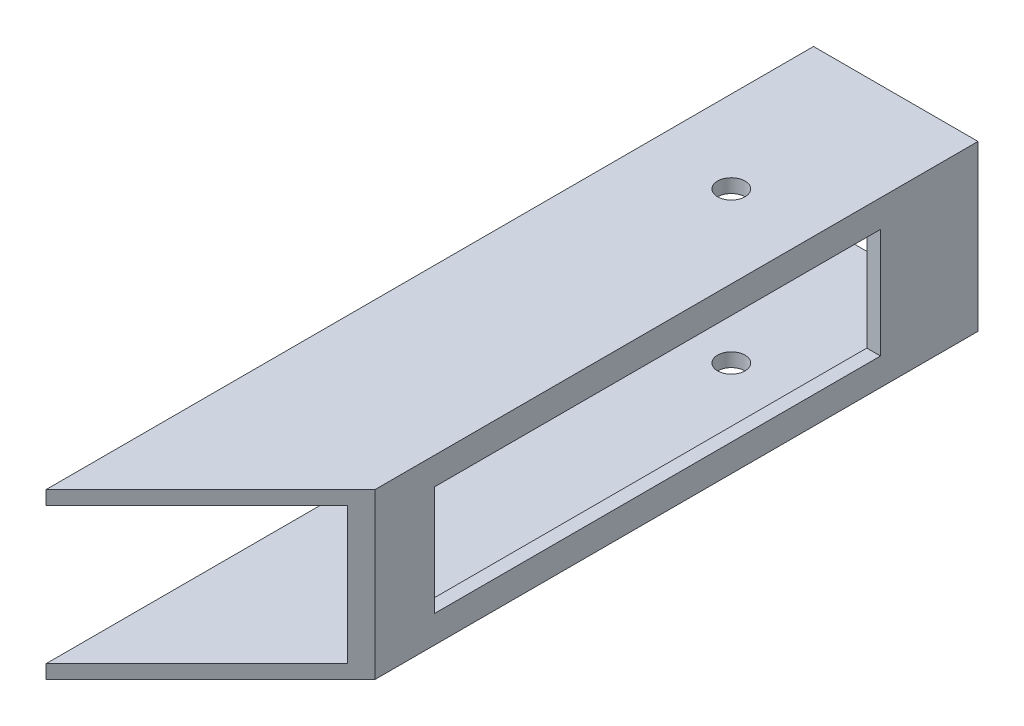
ISO-10303-21;
HEADER;
FILE_DESCRIPTION(('STEP AP214'),'2;1');
FILE_NAME('part.step','',(''),(''),'','','');
FILE_SCHEMA(('AUTOMOTIVE_DESIGN { 1 0 10303 214 1 1 1 1 }'));
ENDSEC;
DATA;
#1=APPLICATION_CONTEXT('core data for automotive mechanical design processes');
#2=APPLICATION_PROTOCOL_DEFINITION('international standard','automotive_design',2000,#1);
#3=PRODUCT_CONTEXT('',#1,'mechanical');
#4=PRODUCT('Part','Part','',(#3));
#5=PRODUCT_RELATED_PRODUCT_CATEGORY('part','',(#4));
#6=PRODUCT_DEFINITION_FORMATION('','',#4);
#7=PRODUCT_DEFINITION_CONTEXT('part definition',#1,'design');
#8=PRODUCT_DEFINITION('design','',#6,#7);
#9=PRODUCT_DEFINITION_SHAPE('','',#8);
#10=(LENGTH_UNIT() NAMED_UNIT(*) SI_UNIT(.MILLI.,.METRE.));
#11=(NAMED_UNIT(*) PLANE_ANGLE_UNIT() SI_UNIT($,.RADIAN.));
#12=(NAMED_UNIT(*) SI_UNIT($,.STERADIAN.) SOLID_ANGLE_UNIT());
#13=UNCERTAINTY_MEASURE_WITH_UNIT(LENGTH_MEASURE(1.E-05),#10,'distance_accuracy_value','');
#14=(GEOMETRIC_REPRESENTATION_CONTEXT(3) GLOBAL_UNCERTAINTY_ASSIGNED_CONTEXT((#13)) GLOBAL_UNIT_ASSIGNED_CONTEXT((#10,
#11,#12)) REPRESENTATION_CONTEXT('',''));
#15=CARTESIAN_POINT('',(0.,0.,0.));
#16=DIRECTION('',(0.,0.,1.));
#17=DIRECTION('',(1.,0.,0.));
#18=AXIS2_PLACEMENT_3D('',#15,#16,#17);
#19=CARTESIAN_POINT('',(-19.05,0.,-12.7));
#20=DIRECTION('',(-1.,0.,0.));
#21=DIRECTION('',(0.,0.,1.));
#22=AXIS2_PLACEMENT_3D('',#19,#20,#21);
#23=PLANE('',#22);
#24=DIRECTION('',(0.,0.,-1.));
#25=VECTOR('',#24,1.);
#26=CARTESIAN_POINT('',(-19.05,34.925,-38.1));
#27=LINE('',#26,#25);
#28=CARTESIAN_POINT('',(-19.05,34.925,139.7));
#29=VERTEX_POINT('',#28);
#30=CARTESIAN_POINT('',(-19.05,34.925,-38.1));
#31=VERTEX_POINT('',#30);
#32=EDGE_CURVE('E152',#29,#31,#27,.T.);
#33=ORIENTED_EDGE('',*,*,#32,.F.);
#34=DIRECTION('',(0.,1.,0.));
#35=VECTOR('',#34,1.);
#36=CARTESIAN_POINT('',(-19.05,-0.000500000000001055,139.7));
#37=LINE('',#36,#35);
#38=CARTESIAN_POINT('',(-19.05,38.1,139.7));
#39=VERTEX_POINT('',#38);
#40=EDGE_CURVE('E175',#29,#39,#37,.T.);
#41=ORIENTED_EDGE('',*,*,#40,.T.);
#42=DIRECTION('',(0.,0.,1.));
#43=VECTOR('',#42,1.);
#44=CARTESIAN_POINT('',(-19.05,38.1,12.7));
#45=LINE('',#44,#43);
#46=CARTESIAN_POINT('',(-19.05,38.1,-38.1));
#47=VERTEX_POINT('',#46);
#48=EDGE_CURVE('E178',#47,#39,#45,.T.);
#49=ORIENTED_EDGE('',*,*,#48,.F.);
#50=DIRECTION('',(0.,1.,0.));
#51=VECTOR('',#50,1.);
#52=CARTESIAN_POINT('',(-19.05,0.,-38.1));
#53=LINE('',#52,#51);
#54=EDGE_CURVE('E168',#31,#47,#53,.T.);
#55=ORIENTED_EDGE('',*,*,#54,.F.);
#56=EDGE_LOOP('',(#33,#41,#49,#55));
#57=FACE_BOUND('',#56,.T.);
#58=ADVANCED_FACE('F33',(#57),#23,.T.);
#59=CARTESIAN_POINT('',(-19.05,-0.00100000000000211,139.7));
#60=DIRECTION('',(0.707106781187333,0.,0.707106781185763));
#61=DIRECTION('',(0.707106781185763,0.,-0.707106781187333));
#62=AXIS2_PLACEMENT_3D('',#59,#60,#61);
#63=PLANE('',#62);
#64=ORIENTED_EDGE('',*,*,#40,.F.);
#65=DIRECTION('',(-0.707106781185763,0.,0.707106781187333));
#66=VECTOR('',#65,1.);
#67=CARTESIAN_POINT('',(20.6374999999894,34.925,100.012499999922));
#68=LINE('',#67,#66);
#69=CARTESIAN_POINT('',(15.875,34.925,104.774999999922));
#70=VERTEX_POINT('',#69);
#71=EDGE_CURVE('E176',#70,#29,#68,.T.);
#72=ORIENTED_EDGE('',*,*,#71,.F.);
#73=DIRECTION('',(0.,1.,0.));
#74=VECTOR('',#73,1.);
#75=CARTESIAN_POINT('',(15.875,-0.000500000000001055,104.774999999922));
#76=LINE('',#75,#74);
#77=CARTESIAN_POINT('',(15.875,3.175,104.774999999922));
#78=VERTEX_POINT('',#77);
#79=EDGE_CURVE('E180',#78,#70,#76,.T.);
#80=ORIENTED_EDGE('',*,*,#79,.F.);
#81=DIRECTION('',(0.707106781185763,0.,-0.707106781187333));
#82=VECTOR('',#81,1.);
#83=CARTESIAN_POINT('',(20.6374999999894,3.175,100.012499999922));
#84=LINE('',#83,#82);
#85=CARTESIAN_POINT('',(-19.05,3.175,139.7));
#86=VERTEX_POINT('',#85);
#87=EDGE_CURVE('E185',#86,#78,#84,.T.);
#88=ORIENTED_EDGE('',*,*,#87,.F.);
#89=CARTESIAN_POINT('',(-19.05,0.,139.7));
#90=VERTEX_POINT('',#89);
#91=EDGE_CURVE('E196',#90,#86,#37,.T.);
#92=ORIENTED_EDGE('',*,*,#91,.F.);
#93=DIRECTION('',(-0.707106781185763,0.,0.707106781187333));
#94=VECTOR('',#93,1.);
#95=CARTESIAN_POINT('',(20.6374999999894,0.,100.012499999922));
#96=LINE('',#95,#94);
#97=CARTESIAN_POINT('',(19.05,0.,101.599999999915));
#98=VERTEX_POINT('',#97);
#99=EDGE_CURVE('E200',#98,#90,#96,.T.);
#100=ORIENTED_EDGE('',*,*,#99,.F.);
#101=DIRECTION('',(0.,-1.,0.));
#102=VECTOR('',#101,1.);
#103=CARTESIAN_POINT('',(19.05,-0.000500000000001055,101.599999999915));
#104=LINE('',#103,#102);
#105=CARTESIAN_POINT('',(19.05,38.1,101.599999999915));
#106=VERTEX_POINT('',#105);
#107=EDGE_CURVE('E188',#106,#98,#104,.T.);
#108=ORIENTED_EDGE('',*,*,#107,.F.);
#109=DIRECTION('',(0.707106781185763,0.,-0.707106781187333));
#110=VECTOR('',#109,1.);
#111=CARTESIAN_POINT('',(20.6374999999894,38.1,100.012499999922));
#112=LINE('',#111,#110);
#113=EDGE_CURVE('E192',#39,#106,#112,.T.);
#114=ORIENTED_EDGE('',*,*,#113,.F.);
#115=EDGE_LOOP('',(#64,#72,#80,#88,#92,#100,#108,#114));
#116=FACE_BOUND('',#115,.T.);
#117=ADVANCED_FACE('F247',(#116),#63,.T.);
#118=CARTESIAN_POINT('',(0.,3.175,0.));
#119=DIRECTION('',(0.,1.,0.));
#120=DIRECTION('',(0.,0.,1.));
#121=AXIS2_PLACEMENT_3D('',#118,#119,#120);
#122=PLANE('',#121);
#123=ORIENTED_EDGE('',*,*,#87,.T.);
#124=DIRECTION('',(0.,0.,1.));
#125=VECTOR('',#124,1.);
#126=CARTESIAN_POINT('',(15.875,3.175,12.7));
#127=LINE('',#126,#125);
#128=CARTESIAN_POINT('',(15.875,3.175,-38.1));
#129=VERTEX_POINT('',#128);
#130=EDGE_CURVE('E204',#129,#78,#127,.T.);
#131=ORIENTED_EDGE('',*,*,#130,.F.);
#132=DIRECTION('',(-1.,0.,0.));
#133=VECTOR('',#132,1.);
#134=CARTESIAN_POINT('',(-15.875,3.175,-38.1));
#135=LINE('',#134,#133);
#136=CARTESIAN_POINT('',(-19.05,3.175,-38.1));
#137=VERTEX_POINT('',#136);
#138=EDGE_CURVE('E160',#129,#137,#135,.T.);
#139=ORIENTED_EDGE('',*,*,#138,.T.);
#140=DIRECTION('',(0.,0.,1.));
#141=VECTOR('',#140,1.);
#142=CARTESIAN_POINT('',(-19.05,3.175,-38.1));
#143=LINE('',#142,#141);
#144=EDGE_CURVE('E147',#137,#86,#143,.T.);
#145=ORIENTED_EDGE('',*,*,#144,.T.);
#146=EDGE_LOOP('',(#123,#131,#139,#145));
#147=FACE_BOUND('',#146,.T.);
#148=CARTESIAN_POINT('',(0.,3.175,0.));
#149=DIRECTION('',(0.,-1.,0.));
#150=DIRECTION('',(0.,0.,-1.));
#151=AXIS2_PLACEMENT_3D('',#148,#149,#150);
#152=CIRCLE('',#151,3.175);
#153=CARTESIAN_POINT('',(0.,3.175,-3.175));
#154=VERTEX_POINT('',#153);
#155=EDGE_CURVE('E183',#154,#154,#152,.T.);
#156=ORIENTED_EDGE('',*,*,#155,.T.);
#157=EDGE_LOOP('',(#156));
#158=FACE_BOUND('',#157,.T.);
#159=ADVANCED_FACE('F254',(#147,#158),#122,.T.);
#160=CARTESIAN_POINT('',(15.875,0.,12.7));
#161=DIRECTION('',(1.,0.,0.));
#162=DIRECTION('',(0.,0.,-1.));
#163=AXIS2_PLACEMENT_3D('',#160,#161,#162);
#164=PLANE('',#163);
#165=DIRECTION('',(0.,0.,1.));
#166=VECTOR('',#165,1.);
#167=CARTESIAN_POINT('',(15.875,6.35,-15.5106927076218));
#168=LINE('',#167,#166);
#169=CARTESIAN_POINT('',(15.875,6.35,-15.5106927076218));
#170=VERTEX_POINT('',#169);
#171=CARTESIAN_POINT('',(15.875,6.35,87.7755200202159));
#172=VERTEX_POINT('',#171);
#173=EDGE_CURVE('E133',#170,#172,#168,.T.);
#174=ORIENTED_EDGE('',*,*,#173,.F.);
#175=DIRECTION('',(0.,-1.,0.));
#176=VECTOR('',#175,1.);
#177=CARTESIAN_POINT('',(15.875,31.75,-15.5106927076218));
#178=LINE('',#177,#176);
#179=CARTESIAN_POINT('',(15.875,31.75,-15.5106927076218));
#180=VERTEX_POINT('',#179);
#181=EDGE_CURVE('E48',#180,#170,#178,.T.);
#182=ORIENTED_EDGE('',*,*,#181,.F.);
#183=DIRECTION('',(0.,0.,-1.));
#184=VECTOR('',#183,1.);
#185=CARTESIAN_POINT('',(15.875,31.75,-15.5106927076218));
#186=LINE('',#185,#184);
#187=CARTESIAN_POINT('',(15.875,31.75,87.775520020216));
#188=VERTEX_POINT('',#187);
#189=EDGE_CURVE('E140',#188,#180,#186,.T.);
#190=ORIENTED_EDGE('',*,*,#189,.F.);
#191=DIRECTION('',(0.,1.,0.));
#192=VECTOR('',#191,1.);
#193=CARTESIAN_POINT('',(15.875,31.75,87.775520020216));
#194=LINE('',#193,#192);
#195=EDGE_CURVE('E124',#172,#188,#194,.T.);
#196=ORIENTED_EDGE('',*,*,#195,.F.);
#197=EDGE_LOOP('',(#174,#182,#190,#196));
#198=FACE_BOUND('',#197,.T.);
#199=ORIENTED_EDGE('',*,*,#79,.T.);
#200=DIRECTION('',(0.,0.,-1.));
#201=VECTOR('',#200,1.);
#202=CARTESIAN_POINT('',(15.875,34.925,6.35));
#203=LINE('',#202,#201);
#204=CARTESIAN_POINT('',(15.875,34.925,-38.1));
#205=VERTEX_POINT('',#204);
#206=EDGE_CURVE('E184',#70,#205,#203,.T.);
#207=ORIENTED_EDGE('',*,*,#206,.T.);
#208=DIRECTION('',(0.,-1.,0.));
#209=VECTOR('',#208,1.);
#210=CARTESIAN_POINT('',(15.875,3.175,-38.1));
#211=LINE('',#210,#209);
#212=EDGE_CURVE('E157',#205,#129,#211,.T.);
#213=ORIENTED_EDGE('',*,*,#212,.T.);
#214=ORIENTED_EDGE('',*,*,#130,.T.);
#215=EDGE_LOOP('',(#199,#207,#213,#214));
#216=FACE_BOUND('',#215,.T.);
#217=ADVANCED_FACE('F137',(#198,#216),#164,.F.);
#218=CARTESIAN_POINT('',(0.,38.1,0.));
#219=DIRECTION('',(0.,1.,0.));
#220=DIRECTION('',(0.,0.,1.));
#221=AXIS2_PLACEMENT_3D('',#218,#219,#220);
#222=PLANE('',#221);
#223=CARTESIAN_POINT('',(0.,38.1,0.));
#224=DIRECTION('',(0.,-1.,0.));
#225=DIRECTION('',(0.,0.,-1.));
#226=AXIS2_PLACEMENT_3D('',#223,#224,#225);
#227=CIRCLE('',#226,3.175);
#228=CARTESIAN_POINT('',(0.,38.1,-3.175));
#229=VERTEX_POINT('',#228);
#230=EDGE_CURVE('E195',#229,#229,#227,.T.);
#231=ORIENTED_EDGE('',*,*,#230,.T.);
#232=EDGE_LOOP('',(#231));
#233=FACE_BOUND('',#232,.T.);
#234=ORIENTED_EDGE('',*,*,#113,.T.);
#235=DIRECTION('',(0.,0.,1.));
#236=VECTOR('',#235,1.);
#237=CARTESIAN_POINT('',(19.05,38.1,12.7));
#238=LINE('',#237,#236);
#239=CARTESIAN_POINT('',(19.05,38.1,-38.1));
#240=VERTEX_POINT('',#239);
#241=EDGE_CURVE('E191',#240,#106,#238,.T.);
#242=ORIENTED_EDGE('',*,*,#241,.F.);
#243=DIRECTION('',(1.,0.,0.));
#244=VECTOR('',#243,1.);
#245=CARTESIAN_POINT('',(-19.05,38.1,-38.1));
#246=LINE('',#245,#244);
#247=EDGE_CURVE('E172',#47,#240,#246,.T.);
#248=ORIENTED_EDGE('',*,*,#247,.F.);
#249=ORIENTED_EDGE('',*,*,#48,.T.);
#250=EDGE_LOOP('',(#234,#242,#248,#249));
#251=FACE_BOUND('',#250,.T.);
#252=ADVANCED_FACE('F282',(#233,#251),#222,.T.);
#253=CARTESIAN_POINT('',(0.,34.925,0.));
#254=DIRECTION('',(0.,1.,0.));
#255=DIRECTION('',(0.,0.,1.));
#256=AXIS2_PLACEMENT_3D('',#253,#254,#255);
#257=PLANE('',#256);
#258=DIRECTION('',(1.,0.,0.));
#259=VECTOR('',#258,1.);
#260=CARTESIAN_POINT('',(15.875,34.925,-38.1));
#261=LINE('',#260,#259);
#262=EDGE_CURVE('E155',#31,#205,#261,.T.);
#263=ORIENTED_EDGE('',*,*,#262,.T.);
#264=ORIENTED_EDGE('',*,*,#206,.F.);
#265=ORIENTED_EDGE('',*,*,#71,.T.);
#266=ORIENTED_EDGE('',*,*,#32,.T.);
#267=EDGE_LOOP('',(#263,#264,#265,#266));
#268=FACE_BOUND('',#267,.T.);
#269=CARTESIAN_POINT('',(0.,34.925,0.));
#270=DIRECTION('',(0.,1.,0.));
#271=DIRECTION('',(1.,0.,0.));
#272=AXIS2_PLACEMENT_3D('',#269,#270,#271);
#273=CIRCLE('',#272,3.175);
#274=CARTESIAN_POINT('',(3.175,34.925,0.));
#275=VERTEX_POINT('',#274);
#276=EDGE_CURVE('E179',#275,#275,#273,.T.);
#277=ORIENTED_EDGE('',*,*,#276,.T.);
#278=EDGE_LOOP('',(#277));
#279=FACE_BOUND('',#278,.T.);
#280=ADVANCED_FACE('F288',(#268,#279),#257,.F.);
#281=CARTESIAN_POINT('',(19.05,0.,12.7));
#282=DIRECTION('',(1.,0.,0.));
#283=DIRECTION('',(0.,0.,-1.));
#284=AXIS2_PLACEMENT_3D('',#281,#282,#283);
#285=PLANE('',#284);
#286=DIRECTION('',(0.,1.,0.));
#287=VECTOR('',#286,1.);
#288=CARTESIAN_POINT('',(19.05,0.,-15.5106927076218));
#289=LINE('',#288,#287);
#290=CARTESIAN_POINT('',(19.05,6.35,-15.5106927076218));
#291=VERTEX_POINT('',#290);
#292=CARTESIAN_POINT('',(19.05,31.75,-15.5106927076218));
#293=VERTEX_POINT('',#292);
#294=EDGE_CURVE('E11',#291,#293,#289,.T.);
#295=ORIENTED_EDGE('',*,*,#294,.F.);
#296=DIRECTION('',(0.,0.,-1.));
#297=VECTOR('',#296,1.);
#298=CARTESIAN_POINT('',(19.05,6.35,12.7));
#299=LINE('',#298,#297);
#300=CARTESIAN_POINT('',(19.05,6.35,87.7755200202159));
#301=VERTEX_POINT('',#300);
#302=EDGE_CURVE('E187',#301,#291,#299,.T.);
#303=ORIENTED_EDGE('',*,*,#302,.F.);
#304=DIRECTION('',(0.,-1.,0.));
#305=VECTOR('',#304,1.);
#306=CARTESIAN_POINT('',(19.05,0.,87.7755200202159));
#307=LINE('',#306,#305);
#308=CARTESIAN_POINT('',(19.05,31.75,87.775520020216));
#309=VERTEX_POINT('',#308);
#310=EDGE_CURVE('E127',#309,#301,#307,.T.);
#311=ORIENTED_EDGE('',*,*,#310,.F.);
#312=DIRECTION('',(0.,0.,1.));
#313=VECTOR('',#312,1.);
#314=CARTESIAN_POINT('',(19.05,31.75,12.7));
#315=LINE('',#314,#313);
#316=EDGE_CURVE('E41',#293,#309,#315,.T.);
#317=ORIENTED_EDGE('',*,*,#316,.F.);
#318=EDGE_LOOP('',(#295,#303,#311,#317));
#319=FACE_BOUND('',#318,.T.);
#320=ORIENTED_EDGE('',*,*,#107,.T.);
#321=DIRECTION('',(0.,0.,1.));
#322=VECTOR('',#321,1.);
#323=CARTESIAN_POINT('',(19.05,0.,12.7));
#324=LINE('',#323,#322);
#325=CARTESIAN_POINT('',(19.05,0.,-38.1));
#326=VERTEX_POINT('',#325);
#327=EDGE_CURVE('E219',#326,#98,#324,.T.);
#328=ORIENTED_EDGE('',*,*,#327,.F.);
#329=DIRECTION('',(0.,-1.,0.));
#330=VECTOR('',#329,1.);
#331=CARTESIAN_POINT('',(19.05,38.1,-38.1));
#332=LINE('',#331,#330);
#333=EDGE_CURVE('E162',#240,#326,#332,.T.);
#334=ORIENTED_EDGE('',*,*,#333,.F.);
#335=ORIENTED_EDGE('',*,*,#241,.T.);
#336=EDGE_LOOP('',(#320,#328,#334,#335));
#337=FACE_BOUND('',#336,.T.);
#338=ADVANCED_FACE('F232',(#319,#337),#285,.T.);
#339=CARTESIAN_POINT('',(0.,0.,0.));
#340=DIRECTION('',(0.,1.,0.));
#341=DIRECTION('',(0.,0.,1.));
#342=AXIS2_PLACEMENT_3D('',#339,#340,#341);
#343=PLANE('',#342);
#344=ORIENTED_EDGE('',*,*,#99,.T.);
#345=DIRECTION('',(0.,0.,-1.));
#346=VECTOR('',#345,1.);
#347=CARTESIAN_POINT('',(-19.05,0.,12.7));
#348=LINE('',#347,#346);
#349=CARTESIAN_POINT('',(-19.05,0.,-38.1));
#350=VERTEX_POINT('',#349);
#351=EDGE_CURVE('E203',#90,#350,#348,.T.);
#352=ORIENTED_EDGE('',*,*,#351,.T.);
#353=DIRECTION('',(-1.,0.,0.));
#354=VECTOR('',#353,1.);
#355=CARTESIAN_POINT('',(19.05,0.,-38.1));
#356=LINE('',#355,#354);
#357=EDGE_CURVE('E165',#326,#350,#356,.T.);
#358=ORIENTED_EDGE('',*,*,#357,.F.);
#359=ORIENTED_EDGE('',*,*,#327,.T.);
#360=EDGE_LOOP('',(#344,#352,#358,#359));
#361=FACE_BOUND('',#360,.T.);
#362=CARTESIAN_POINT('',(0.,0.,0.));
#363=DIRECTION('',(0.,1.,0.));
#364=DIRECTION('',(1.,0.,0.));
#365=AXIS2_PLACEMENT_3D('',#362,#363,#364);
#366=CIRCLE('',#365,3.175);
#367=CARTESIAN_POINT('',(3.175,0.,0.));
#368=VERTEX_POINT('',#367);
#369=EDGE_CURVE('E199',#368,#368,#366,.T.);
#370=ORIENTED_EDGE('',*,*,#369,.T.);
#371=EDGE_LOOP('',(#370));
#372=FACE_BOUND('',#371,.T.);
#373=ADVANCED_FACE('F261',(#361,#372),#343,.F.);
#374=ORIENTED_EDGE('',*,*,#144,.F.);
#375=EDGE_CURVE('E169',#350,#137,#53,.T.);
#376=ORIENTED_EDGE('',*,*,#375,.F.);
#377=ORIENTED_EDGE('',*,*,#351,.F.);
#378=ORIENTED_EDGE('',*,*,#91,.T.);
#379=EDGE_LOOP('',(#374,#376,#377,#378));
#380=FACE_BOUND('',#379,.T.);
#381=ADVANCED_FACE('F250',(#380),#23,.T.);
#382=CARTESIAN_POINT('',(0.,-21.4682801497576,0.));
#383=DIRECTION('',(0.,1.,0.));
#384=DIRECTION('',(1.,0.,0.));
#385=AXIS2_PLACEMENT_3D('',#382,#383,#384);
#386=CYLINDRICAL_SURFACE('',#385,3.175);
#387=ORIENTED_EDGE('',*,*,#369,.F.);
#388=EDGE_LOOP('',(#387));
#389=FACE_BOUND('',#388,.T.);
#390=ORIENTED_EDGE('',*,*,#155,.F.);
#391=EDGE_LOOP('',(#390));
#392=FACE_BOUND('',#391,.T.);
#393=ADVANCED_FACE('F260',(#389,#392),#386,.F.);
#394=CARTESIAN_POINT('',(0.,-21.4682801497576,0.));
#395=DIRECTION('',(0.,1.,0.));
#396=DIRECTION('',(1.,0.,0.));
#397=AXIS2_PLACEMENT_3D('',#394,#395,#396);
#398=CYLINDRICAL_SURFACE('',#397,3.175);
#399=ORIENTED_EDGE('',*,*,#276,.F.);
#400=EDGE_LOOP('',(#399));
#401=FACE_BOUND('',#400,.T.);
#402=ORIENTED_EDGE('',*,*,#230,.F.);
#403=EDGE_LOOP('',(#402));
#404=FACE_BOUND('',#403,.T.);
#405=ADVANCED_FACE('F35',(#401,#404),#398,.F.);
#406=CARTESIAN_POINT('',(0.,0.,-38.1));
#407=DIRECTION('',(0.,0.,-1.));
#408=DIRECTION('',(-1.,0.,0.));
#409=AXIS2_PLACEMENT_3D('',#406,#407,#408);
#410=PLANE('',#409);
#411=ORIENTED_EDGE('',*,*,#262,.F.);
#412=ORIENTED_EDGE('',*,*,#54,.T.);
#413=ORIENTED_EDGE('',*,*,#247,.T.);
#414=ORIENTED_EDGE('',*,*,#333,.T.);
#415=ORIENTED_EDGE('',*,*,#357,.T.);
#416=ORIENTED_EDGE('',*,*,#375,.T.);
#417=ORIENTED_EDGE('',*,*,#138,.F.);
#418=ORIENTED_EDGE('',*,*,#212,.F.);
#419=EDGE_LOOP('',(#411,#412,#413,#414,#415,#416,#417,#418));
#420=FACE_BOUND('',#419,.T.);
#421=ADVANCED_FACE('F236',(#420),#410,.T.);
#422=CARTESIAN_POINT('',(20.447,31.75,-15.5106927076218));
#423=DIRECTION('',(0.,0.,-1.));
#424=DIRECTION('',(0.,1.,0.));
#425=AXIS2_PLACEMENT_3D('',#422,#423,#424);
#426=PLANE('',#425);
#427=ORIENTED_EDGE('',*,*,#294,.T.);
#428=DIRECTION('',(-1.,0.,0.));
#429=VECTOR('',#428,1.);
#430=CARTESIAN_POINT('',(20.447,31.75,-15.5106927076218));
#431=LINE('',#430,#429);
#432=EDGE_CURVE('E145',#293,#180,#431,.T.);
#433=ORIENTED_EDGE('',*,*,#432,.T.);
#434=ORIENTED_EDGE('',*,*,#181,.T.);
#435=DIRECTION('',(-1.,0.,0.));
#436=VECTOR('',#435,1.);
#437=CARTESIAN_POINT('',(20.447,6.35,-15.5106927076218));
#438=LINE('',#437,#436);
#439=EDGE_CURVE('E130',#291,#170,#438,.T.);
#440=ORIENTED_EDGE('',*,*,#439,.F.);
#441=EDGE_LOOP('',(#427,#433,#434,#440));
#442=FACE_BOUND('',#441,.T.);
#443=ADVANCED_FACE('F234',(#442),#426,.F.);
#444=CARTESIAN_POINT('',(20.447,31.75,-15.5106927076218));
#445=DIRECTION('',(0.,1.,0.));
#446=DIRECTION('',(0.,0.,1.));
#447=AXIS2_PLACEMENT_3D('',#444,#445,#446);
#448=PLANE('',#447);
#449=ORIENTED_EDGE('',*,*,#316,.T.);
#450=DIRECTION('',(-1.,0.,0.));
#451=VECTOR('',#450,1.);
#452=CARTESIAN_POINT('',(20.447,31.75,87.775520020216));
#453=LINE('',#452,#451);
#454=EDGE_CURVE('E129',#309,#188,#453,.T.);
#455=ORIENTED_EDGE('',*,*,#454,.T.);
#456=ORIENTED_EDGE('',*,*,#189,.T.);
#457=ORIENTED_EDGE('',*,*,#432,.F.);
#458=EDGE_LOOP('',(#449,#455,#456,#457));
#459=FACE_BOUND('',#458,.T.);
#460=ADVANCED_FACE('F229',(#459),#448,.F.);
#461=CARTESIAN_POINT('',(20.447,31.75,87.775520020216));
#462=DIRECTION('',(0.,0.,1.));
#463=DIRECTION('',(0.,-1.,0.));
#464=AXIS2_PLACEMENT_3D('',#461,#462,#463);
#465=PLANE('',#464);
#466=ORIENTED_EDGE('',*,*,#310,.T.);
#467=DIRECTION('',(-1.,0.,0.));
#468=VECTOR('',#467,1.);
#469=CARTESIAN_POINT('',(20.447,6.35,87.7755200202159));
#470=LINE('',#469,#468);
#471=EDGE_CURVE('E56',#301,#172,#470,.T.);
#472=ORIENTED_EDGE('',*,*,#471,.T.);
#473=ORIENTED_EDGE('',*,*,#195,.T.);
#474=ORIENTED_EDGE('',*,*,#454,.F.);
#475=EDGE_LOOP('',(#466,#472,#473,#474));
#476=FACE_BOUND('',#475,.T.);
#477=ADVANCED_FACE('F121',(#476),#465,.F.);
#478=CARTESIAN_POINT('',(20.447,6.35,-15.5106927076218));
#479=DIRECTION('',(0.,-1.,0.));
#480=DIRECTION('',(0.,0.,-1.));
#481=AXIS2_PLACEMENT_3D('',#478,#479,#480);
#482=PLANE('',#481);
#483=ORIENTED_EDGE('',*,*,#302,.T.);
#484=ORIENTED_EDGE('',*,*,#439,.T.);
#485=ORIENTED_EDGE('',*,*,#173,.T.);
#486=ORIENTED_EDGE('',*,*,#471,.F.);
#487=EDGE_LOOP('',(#483,#484,#485,#486));
#488=FACE_BOUND('',#487,.T.);
#489=ADVANCED_FACE('F134',(#488),#482,.F.);
#490=CLOSED_SHELL('',(#58,#117,#159,#217,#252,#280,#338,#373,#381,#393,#405,#421,#443,#460,#477,#489));
#491=MANIFOLD_SOLID_BREP('B2',#490);
#492=ADVANCED_BREP_SHAPE_REPRESENTATION('',(#18,#491),#14);
#493=SHAPE_DEFINITION_REPRESENTATION(#9,#492);
ENDSEC;
END-ISO-10303-21;
